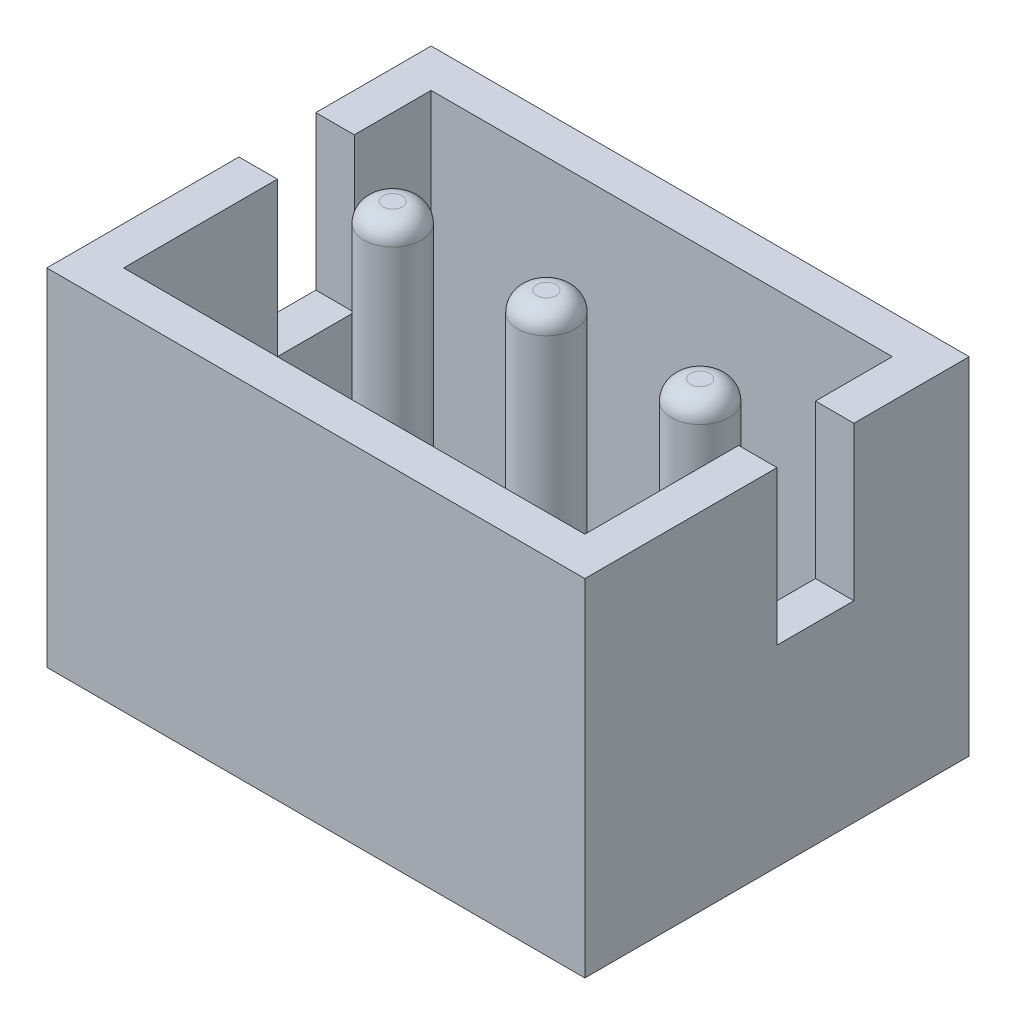
ISO-10303-21;
HEADER;
FILE_DESCRIPTION(('STEP AP214'),'2;1');
FILE_NAME('part.step','',(''),(''),'','','');
FILE_SCHEMA(('AUTOMOTIVE_DESIGN { 1 0 10303 214 1 1 1 1 }'));
ENDSEC;
DATA;
#1=APPLICATION_CONTEXT('core data for automotive mechanical design processes');
#2=APPLICATION_PROTOCOL_DEFINITION('international standard','automotive_design',2000,#1);
#3=PRODUCT_CONTEXT('',#1,'mechanical');
#4=PRODUCT('Part','Part','',(#3));
#5=PRODUCT_RELATED_PRODUCT_CATEGORY('part','',(#4));
#6=PRODUCT_DEFINITION_FORMATION('','',#4);
#7=PRODUCT_DEFINITION_CONTEXT('part definition',#1,'design');
#8=PRODUCT_DEFINITION('design','',#6,#7);
#9=PRODUCT_DEFINITION_SHAPE('','',#8);
#10=(LENGTH_UNIT() NAMED_UNIT(*) SI_UNIT(.MILLI.,.METRE.));
#11=(NAMED_UNIT(*) PLANE_ANGLE_UNIT() SI_UNIT($,.RADIAN.));
#12=(NAMED_UNIT(*) SI_UNIT($,.STERADIAN.) SOLID_ANGLE_UNIT());
#13=UNCERTAINTY_MEASURE_WITH_UNIT(LENGTH_MEASURE(1.E-05),#10,'distance_accuracy_value','');
#14=(GEOMETRIC_REPRESENTATION_CONTEXT(3) GLOBAL_UNCERTAINTY_ASSIGNED_CONTEXT((#13)) GLOBAL_UNIT_ASSIGNED_CONTEXT((#10,
#11,#12)) REPRESENTATION_CONTEXT('',''));
#15=CARTESIAN_POINT('',(0.,0.,0.));
#16=DIRECTION('',(0.,0.,1.));
#17=DIRECTION('',(1.,0.,0.));
#18=AXIS2_PLACEMENT_3D('',#15,#16,#17);
#19=CARTESIAN_POINT('',(3.,4.5,2.));
#20=DIRECTION('',(-1.,0.,0.));
#21=DIRECTION('',(0.,0.,1.));
#22=AXIS2_PLACEMENT_3D('',#19,#20,#21);
#23=PLANE('',#22);
#24=DIRECTION('',(0.,1.,0.));
#25=VECTOR('',#24,1.);
#26=CARTESIAN_POINT('',(3.,2.5,-1.));
#27=LINE('',#26,#25);
#28=CARTESIAN_POINT('',(3.,2.5,-1.));
#29=VERTEX_POINT('',#28);
#30=CARTESIAN_POINT('',(3.,4.5,-1.));
#31=VERTEX_POINT('',#30);
#32=EDGE_CURVE('E325',#29,#31,#27,.T.);
#33=ORIENTED_EDGE('',*,*,#32,.T.);
#34=DIRECTION('',(0.,0.,-1.));
#35=VECTOR('',#34,1.);
#36=CARTESIAN_POINT('',(3.,4.5,2.));
#37=LINE('',#36,#35);
#38=CARTESIAN_POINT('',(3.,4.5,-2.));
#39=VERTEX_POINT('',#38);
#40=EDGE_CURVE('E202',#31,#39,#37,.T.);
#41=ORIENTED_EDGE('',*,*,#40,.T.);
#42=DIRECTION('',(0.,-1.,0.));
#43=VECTOR('',#42,1.);
#44=CARTESIAN_POINT('',(3.,4.5,-2.));
#45=LINE('',#44,#43);
#46=CARTESIAN_POINT('',(3.,0.5,-2.));
#47=VERTEX_POINT('',#46);
#48=EDGE_CURVE('E209',#39,#47,#45,.T.);
#49=ORIENTED_EDGE('',*,*,#48,.T.);
#50=DIRECTION('',(0.,0.,-1.));
#51=VECTOR('',#50,1.);
#52=CARTESIAN_POINT('',(3.,0.5,2.));
#53=LINE('',#52,#51);
#54=CARTESIAN_POINT('',(3.,0.5,2.));
#55=VERTEX_POINT('',#54);
#56=EDGE_CURVE('E193',#55,#47,#53,.T.);
#57=ORIENTED_EDGE('',*,*,#56,.F.);
#58=DIRECTION('',(0.,-1.,0.));
#59=VECTOR('',#58,1.);
#60=CARTESIAN_POINT('',(3.,4.5,2.));
#61=LINE('',#60,#59);
#62=CARTESIAN_POINT('',(3.,4.5,2.));
#63=VERTEX_POINT('',#62);
#64=EDGE_CURVE('E186',#63,#55,#61,.T.);
#65=ORIENTED_EDGE('',*,*,#64,.F.);
#66=CARTESIAN_POINT('',(3.,4.5,0.));
#67=VERTEX_POINT('',#66);
#68=EDGE_CURVE('E362',#63,#67,#37,.T.);
#69=ORIENTED_EDGE('',*,*,#68,.T.);
#70=DIRECTION('',(0.,-1.,0.));
#71=VECTOR('',#70,1.);
#72=CARTESIAN_POINT('',(3.,4.5,0.));
#73=LINE('',#72,#71);
#74=CARTESIAN_POINT('',(3.,2.5,0.));
#75=VERTEX_POINT('',#74);
#76=EDGE_CURVE('E164',#67,#75,#73,.T.);
#77=ORIENTED_EDGE('',*,*,#76,.T.);
#78=DIRECTION('',(0.,0.,-1.));
#79=VECTOR('',#78,1.);
#80=CARTESIAN_POINT('',(3.,2.5,0.));
#81=LINE('',#80,#79);
#82=EDGE_CURVE('E322',#75,#29,#81,.T.);
#83=ORIENTED_EDGE('',*,*,#82,.T.);
#84=EDGE_LOOP('',(#33,#41,#49,#57,#65,#69,#77,#83));
#85=FACE_BOUND('',#84,.T.);
#86=ADVANCED_FACE('F39',(#85),#23,.T.);
#87=CARTESIAN_POINT('',(-3.,4.5,-2.));
#88=DIRECTION('',(0.,0.,1.));
#89=DIRECTION('',(1.,0.,0.));
#90=AXIS2_PLACEMENT_3D('',#87,#88,#89);
#91=PLANE('',#90);
#92=DIRECTION('',(-1.,0.,0.));
#93=VECTOR('',#92,1.);
#94=CARTESIAN_POINT('',(-3.,0.5,-2.));
#95=LINE('',#94,#93);
#96=CARTESIAN_POINT('',(-3.,0.5,-2.));
#97=VERTEX_POINT('',#96);
#98=EDGE_CURVE('E196',#47,#97,#95,.T.);
#99=ORIENTED_EDGE('',*,*,#98,.F.);
#100=ORIENTED_EDGE('',*,*,#48,.F.);
#101=DIRECTION('',(-1.,0.,0.));
#102=VECTOR('',#101,1.);
#103=CARTESIAN_POINT('',(-3.,4.5,-2.));
#104=LINE('',#103,#102);
#105=CARTESIAN_POINT('',(-3.,4.5,-2.));
#106=VERTEX_POINT('',#105);
#107=EDGE_CURVE('E189',#39,#106,#104,.T.);
#108=ORIENTED_EDGE('',*,*,#107,.T.);
#109=DIRECTION('',(0.,-1.,0.));
#110=VECTOR('',#109,1.);
#111=CARTESIAN_POINT('',(-3.,4.5,-2.));
#112=LINE('',#111,#110);
#113=EDGE_CURVE('E181',#106,#97,#112,.T.);
#114=ORIENTED_EDGE('',*,*,#113,.T.);
#115=EDGE_LOOP('',(#99,#100,#108,#114));
#116=FACE_BOUND('',#115,.T.);
#117=ADVANCED_FACE('F255',(#116),#91,.T.);
#118=CARTESIAN_POINT('',(-3.,4.5,2.));
#119=DIRECTION('',(1.,0.,0.));
#120=DIRECTION('',(0.,0.,-1.));
#121=AXIS2_PLACEMENT_3D('',#118,#119,#120);
#122=PLANE('',#121);
#123=DIRECTION('',(0.,-1.,0.));
#124=VECTOR('',#123,1.);
#125=CARTESIAN_POINT('',(-3.,2.5,-1.));
#126=LINE('',#125,#124);
#127=CARTESIAN_POINT('',(-3.,4.5,-1.));
#128=VERTEX_POINT('',#127);
#129=CARTESIAN_POINT('',(-3.,2.5,-1.));
#130=VERTEX_POINT('',#129);
#131=EDGE_CURVE('E154',#128,#130,#126,.T.);
#132=ORIENTED_EDGE('',*,*,#131,.T.);
#133=DIRECTION('',(0.,0.,1.));
#134=VECTOR('',#133,1.);
#135=CARTESIAN_POINT('',(-3.,2.5,0.));
#136=LINE('',#135,#134);
#137=CARTESIAN_POINT('',(-3.,2.5,0.));
#138=VERTEX_POINT('',#137);
#139=EDGE_CURVE('E165',#130,#138,#136,.T.);
#140=ORIENTED_EDGE('',*,*,#139,.T.);
#141=DIRECTION('',(0.,1.,0.));
#142=VECTOR('',#141,1.);
#143=CARTESIAN_POINT('',(-3.,4.5,0.));
#144=LINE('',#143,#142);
#145=CARTESIAN_POINT('',(-3.,4.5,0.));
#146=VERTEX_POINT('',#145);
#147=EDGE_CURVE('E316',#138,#146,#144,.T.);
#148=ORIENTED_EDGE('',*,*,#147,.T.);
#149=DIRECTION('',(0.,0.,1.));
#150=VECTOR('',#149,1.);
#151=CARTESIAN_POINT('',(-3.,4.5,2.));
#152=LINE('',#151,#150);
#153=CARTESIAN_POINT('',(-3.,4.5,2.));
#154=VERTEX_POINT('',#153);
#155=EDGE_CURVE('E183',#146,#154,#152,.T.);
#156=ORIENTED_EDGE('',*,*,#155,.T.);
#157=DIRECTION('',(0.,-1.,0.));
#158=VECTOR('',#157,1.);
#159=CARTESIAN_POINT('',(-3.,4.5,2.));
#160=LINE('',#159,#158);
#161=CARTESIAN_POINT('',(-3.,0.5,2.));
#162=VERTEX_POINT('',#161);
#163=EDGE_CURVE('E205',#154,#162,#160,.T.);
#164=ORIENTED_EDGE('',*,*,#163,.T.);
#165=DIRECTION('',(0.,0.,1.));
#166=VECTOR('',#165,1.);
#167=CARTESIAN_POINT('',(-3.,0.5,2.));
#168=LINE('',#167,#166);
#169=EDGE_CURVE('E198',#97,#162,#168,.T.);
#170=ORIENTED_EDGE('',*,*,#169,.F.);
#171=ORIENTED_EDGE('',*,*,#113,.F.);
#172=EDGE_CURVE('E169',#106,#128,#152,.T.);
#173=ORIENTED_EDGE('',*,*,#172,.T.);
#174=EDGE_LOOP('',(#132,#140,#148,#156,#164,#170,#171,#173));
#175=FACE_BOUND('',#174,.T.);
#176=ADVANCED_FACE('F178',(#175),#122,.T.);
#177=CARTESIAN_POINT('',(-3.,4.5,2.));
#178=DIRECTION('',(0.,0.,-1.));
#179=DIRECTION('',(-1.,0.,0.));
#180=AXIS2_PLACEMENT_3D('',#177,#178,#179);
#181=PLANE('',#180);
#182=DIRECTION('',(1.,0.,0.));
#183=VECTOR('',#182,1.);
#184=CARTESIAN_POINT('',(-3.,0.5,2.));
#185=LINE('',#184,#183);
#186=EDGE_CURVE('E200',#162,#55,#185,.T.);
#187=ORIENTED_EDGE('',*,*,#186,.F.);
#188=ORIENTED_EDGE('',*,*,#163,.F.);
#189=DIRECTION('',(1.,0.,0.));
#190=VECTOR('',#189,1.);
#191=CARTESIAN_POINT('',(-3.,4.5,2.));
#192=LINE('',#191,#190);
#193=EDGE_CURVE('E182',#154,#63,#192,.T.);
#194=ORIENTED_EDGE('',*,*,#193,.T.);
#195=ORIENTED_EDGE('',*,*,#64,.T.);
#196=EDGE_LOOP('',(#187,#188,#194,#195));
#197=FACE_BOUND('',#196,.T.);
#198=ADVANCED_FACE('F373',(#197),#181,.T.);
#199=CARTESIAN_POINT('',(0.,0.5,0.));
#200=DIRECTION('',(0.,1.,0.));
#201=DIRECTION('',(0.,0.,1.));
#202=AXIS2_PLACEMENT_3D('',#199,#200,#201);
#203=PLANE('',#202);
#204=CARTESIAN_POINT('',(0.,0.5,-0.5));
#205=DIRECTION('',(0.,1.,0.));
#206=DIRECTION('',(0.,0.,1.));
#207=AXIS2_PLACEMENT_3D('',#204,#205,#206);
#208=CIRCLE('',#207,0.375);
#209=CARTESIAN_POINT('',(0.,0.5,-0.125));
#210=VERTEX_POINT('',#209);
#211=EDGE_CURVE('E306',#210,#210,#208,.T.);
#212=ORIENTED_EDGE('',*,*,#211,.F.);
#213=EDGE_LOOP('',(#212));
#214=FACE_BOUND('',#213,.T.);
#215=CARTESIAN_POINT('',(2.,0.5,-0.5));
#216=DIRECTION('',(0.,1.,0.));
#217=DIRECTION('',(0.,0.,1.));
#218=AXIS2_PLACEMENT_3D('',#215,#216,#217);
#219=CIRCLE('',#218,0.375);
#220=CARTESIAN_POINT('',(2.,0.5,-0.125000000000001));
#221=VERTEX_POINT('',#220);
#222=EDGE_CURVE('E308',#221,#221,#219,.T.);
#223=ORIENTED_EDGE('',*,*,#222,.F.);
#224=EDGE_LOOP('',(#223));
#225=FACE_BOUND('',#224,.T.);
#226=CARTESIAN_POINT('',(-2.,0.5,-0.5));
#227=DIRECTION('',(0.,1.,0.));
#228=DIRECTION('',(0.,0.,1.));
#229=AXIS2_PLACEMENT_3D('',#226,#227,#228);
#230=CIRCLE('',#229,0.375);
#231=CARTESIAN_POINT('',(-2.,0.5,-0.125));
#232=VERTEX_POINT('',#231);
#233=EDGE_CURVE('E311',#232,#232,#230,.T.);
#234=ORIENTED_EDGE('',*,*,#233,.F.);
#235=EDGE_LOOP('',(#234));
#236=FACE_BOUND('',#235,.T.);
#237=ORIENTED_EDGE('',*,*,#56,.T.);
#238=ORIENTED_EDGE('',*,*,#98,.T.);
#239=ORIENTED_EDGE('',*,*,#169,.T.);
#240=ORIENTED_EDGE('',*,*,#186,.T.);
#241=EDGE_LOOP('',(#237,#238,#239,#240));
#242=FACE_BOUND('',#241,.T.);
#243=ADVANCED_FACE('F370',(#214,#225,#236,#242),#203,.T.);
#244=CARTESIAN_POINT('',(-3.501,4.5,2.5));
#245=DIRECTION('',(0.,-1.,0.));
#246=DIRECTION('',(0.,0.,-1.));
#247=AXIS2_PLACEMENT_3D('',#244,#245,#246);
#248=PLANE('',#247);
#249=ORIENTED_EDGE('',*,*,#40,.F.);
#250=DIRECTION('',(1.,0.,0.));
#251=VECTOR('',#250,1.);
#252=CARTESIAN_POINT('',(-3.501,4.5,-1.));
#253=LINE('',#252,#251);
#254=CARTESIAN_POINT('',(3.5,4.5,-1.));
#255=VERTEX_POINT('',#254);
#256=EDGE_CURVE('E175',#31,#255,#253,.T.);
#257=ORIENTED_EDGE('',*,*,#256,.T.);
#258=DIRECTION('',(0.,0.,-1.));
#259=VECTOR('',#258,1.);
#260=CARTESIAN_POINT('',(3.5,4.5,-1.));
#261=LINE('',#260,#259);
#262=CARTESIAN_POINT('',(3.5,4.5,-2.5));
#263=VERTEX_POINT('',#262);
#264=EDGE_CURVE('E348',#255,#263,#261,.T.);
#265=ORIENTED_EDGE('',*,*,#264,.T.);
#266=DIRECTION('',(1.,0.,0.));
#267=VECTOR('',#266,1.);
#268=CARTESIAN_POINT('',(-3.501,4.5,-2.5));
#269=LINE('',#268,#267);
#270=CARTESIAN_POINT('',(-3.5,4.5,-2.5));
#271=VERTEX_POINT('',#270);
#272=EDGE_CURVE('E174',#271,#263,#269,.T.);
#273=ORIENTED_EDGE('',*,*,#272,.F.);
#274=DIRECTION('',(0.,0.,1.));
#275=VECTOR('',#274,1.);
#276=CARTESIAN_POINT('',(-3.5,4.5,-1.));
#277=LINE('',#276,#275);
#278=CARTESIAN_POINT('',(-3.5,4.5,-1.));
#279=VERTEX_POINT('',#278);
#280=EDGE_CURVE('E172',#271,#279,#277,.T.);
#281=ORIENTED_EDGE('',*,*,#280,.T.);
#282=EDGE_CURVE('E158',#279,#128,#253,.T.);
#283=ORIENTED_EDGE('',*,*,#282,.T.);
#284=ORIENTED_EDGE('',*,*,#172,.F.);
#285=ORIENTED_EDGE('',*,*,#107,.F.);
#286=EDGE_LOOP('',(#249,#257,#265,#273,#281,#283,#284,#285));
#287=FACE_BOUND('',#286,.T.);
#288=ADVANCED_FACE('F168',(#287),#248,.F.);
#289=CARTESIAN_POINT('',(-3.501,2.5,-1.));
#290=DIRECTION('',(0.,0.,-1.));
#291=DIRECTION('',(-1.,0.,0.));
#292=AXIS2_PLACEMENT_3D('',#289,#290,#291);
#293=PLANE('',#292);
#294=DIRECTION('',(0.,-1.,0.));
#295=VECTOR('',#294,1.);
#296=CARTESIAN_POINT('',(-3.5,2.5,-1.));
#297=LINE('',#296,#295);
#298=CARTESIAN_POINT('',(-3.5,2.5,-1.));
#299=VERTEX_POINT('',#298);
#300=EDGE_CURVE('E333',#279,#299,#297,.T.);
#301=ORIENTED_EDGE('',*,*,#300,.T.);
#302=DIRECTION('',(1.,0.,0.));
#303=VECTOR('',#302,1.);
#304=CARTESIAN_POINT('',(-3.501,2.5,-1.));
#305=LINE('',#304,#303);
#306=EDGE_CURVE('E160',#299,#130,#305,.T.);
#307=ORIENTED_EDGE('',*,*,#306,.T.);
#308=ORIENTED_EDGE('',*,*,#131,.F.);
#309=ORIENTED_EDGE('',*,*,#282,.F.);
#310=EDGE_LOOP('',(#301,#307,#308,#309));
#311=FACE_BOUND('',#310,.T.);
#312=ADVANCED_FACE('F157',(#311),#293,.F.);
#313=CARTESIAN_POINT('',(3.5,2.5,-1.));
#314=VERTEX_POINT('',#313);
#315=EDGE_CURVE('E353',#29,#314,#305,.T.);
#316=ORIENTED_EDGE('',*,*,#315,.T.);
#317=DIRECTION('',(0.,1.,0.));
#318=VECTOR('',#317,1.);
#319=CARTESIAN_POINT('',(3.5,2.5,-1.));
#320=LINE('',#319,#318);
#321=EDGE_CURVE('E345',#314,#255,#320,.T.);
#322=ORIENTED_EDGE('',*,*,#321,.T.);
#323=ORIENTED_EDGE('',*,*,#256,.F.);
#324=ORIENTED_EDGE('',*,*,#32,.F.);
#325=EDGE_LOOP('',(#316,#322,#323,#324));
#326=FACE_BOUND('',#325,.T.);
#327=ADVANCED_FACE('F399',(#326),#293,.F.);
#328=CARTESIAN_POINT('',(-3.501,2.5,0.));
#329=DIRECTION('',(0.,-1.,0.));
#330=DIRECTION('',(0.,0.,-1.));
#331=AXIS2_PLACEMENT_3D('',#328,#329,#330);
#332=PLANE('',#331);
#333=DIRECTION('',(0.,0.,1.));
#334=VECTOR('',#333,1.);
#335=CARTESIAN_POINT('',(-3.5,2.5,0.));
#336=LINE('',#335,#334);
#337=CARTESIAN_POINT('',(-3.5,2.5,0.));
#338=VERTEX_POINT('',#337);
#339=EDGE_CURVE('E330',#299,#338,#336,.T.);
#340=ORIENTED_EDGE('',*,*,#339,.T.);
#341=DIRECTION('',(1.,0.,0.));
#342=VECTOR('',#341,1.);
#343=CARTESIAN_POINT('',(-3.501,2.5,0.));
#344=LINE('',#343,#342);
#345=EDGE_CURVE('E355',#338,#138,#344,.T.);
#346=ORIENTED_EDGE('',*,*,#345,.T.);
#347=ORIENTED_EDGE('',*,*,#139,.F.);
#348=ORIENTED_EDGE('',*,*,#306,.F.);
#349=EDGE_LOOP('',(#340,#346,#347,#348));
#350=FACE_BOUND('',#349,.T.);
#351=ADVANCED_FACE('F381',(#350),#332,.F.);
#352=CARTESIAN_POINT('',(3.5,2.5,0.));
#353=VERTEX_POINT('',#352);
#354=EDGE_CURVE('E356',#75,#353,#344,.T.);
#355=ORIENTED_EDGE('',*,*,#354,.T.);
#356=DIRECTION('',(0.,0.,-1.));
#357=VECTOR('',#356,1.);
#358=CARTESIAN_POINT('',(3.5,2.5,0.));
#359=LINE('',#358,#357);
#360=EDGE_CURVE('E342',#353,#314,#359,.T.);
#361=ORIENTED_EDGE('',*,*,#360,.T.);
#362=ORIENTED_EDGE('',*,*,#315,.F.);
#363=ORIENTED_EDGE('',*,*,#82,.F.);
#364=EDGE_LOOP('',(#355,#361,#362,#363));
#365=FACE_BOUND('',#364,.T.);
#366=ADVANCED_FACE('F397',(#365),#332,.F.);
#367=CARTESIAN_POINT('',(-3.501,4.5,0.));
#368=DIRECTION('',(0.,0.,1.));
#369=DIRECTION('',(0.,-1.,0.));
#370=AXIS2_PLACEMENT_3D('',#367,#368,#369);
#371=PLANE('',#370);
#372=DIRECTION('',(0.,1.,0.));
#373=VECTOR('',#372,1.);
#374=CARTESIAN_POINT('',(-3.5,4.5,0.));
#375=LINE('',#374,#373);
#376=CARTESIAN_POINT('',(-3.5,4.5,0.));
#377=VERTEX_POINT('',#376);
#378=EDGE_CURVE('E327',#338,#377,#375,.T.);
#379=ORIENTED_EDGE('',*,*,#378,.T.);
#380=DIRECTION('',(1.,0.,0.));
#381=VECTOR('',#380,1.);
#382=CARTESIAN_POINT('',(-3.501,4.5,0.));
#383=LINE('',#382,#381);
#384=EDGE_CURVE('E358',#377,#146,#383,.T.);
#385=ORIENTED_EDGE('',*,*,#384,.T.);
#386=ORIENTED_EDGE('',*,*,#147,.F.);
#387=ORIENTED_EDGE('',*,*,#345,.F.);
#388=EDGE_LOOP('',(#379,#385,#386,#387));
#389=FACE_BOUND('',#388,.T.);
#390=ADVANCED_FACE('F379',(#389),#371,.F.);
#391=CARTESIAN_POINT('',(3.5,4.5,0.));
#392=VERTEX_POINT('',#391);
#393=EDGE_CURVE('E359',#67,#392,#383,.T.);
#394=ORIENTED_EDGE('',*,*,#393,.T.);
#395=DIRECTION('',(0.,-1.,0.));
#396=VECTOR('',#395,1.);
#397=CARTESIAN_POINT('',(3.5,4.5,0.));
#398=LINE('',#397,#396);
#399=EDGE_CURVE('E339',#392,#353,#398,.T.);
#400=ORIENTED_EDGE('',*,*,#399,.T.);
#401=ORIENTED_EDGE('',*,*,#354,.F.);
#402=ORIENTED_EDGE('',*,*,#76,.F.);
#403=EDGE_LOOP('',(#394,#400,#401,#402));
#404=FACE_BOUND('',#403,.T.);
#405=ADVANCED_FACE('F394',(#404),#371,.F.);
#406=ORIENTED_EDGE('',*,*,#68,.F.);
#407=ORIENTED_EDGE('',*,*,#193,.F.);
#408=ORIENTED_EDGE('',*,*,#155,.F.);
#409=ORIENTED_EDGE('',*,*,#384,.F.);
#410=DIRECTION('',(0.,0.,1.));
#411=VECTOR('',#410,1.);
#412=CARTESIAN_POINT('',(-3.5,4.5,2.5));
#413=LINE('',#412,#411);
#414=CARTESIAN_POINT('',(-3.5,4.5,2.5));
#415=VERTEX_POINT('',#414);
#416=EDGE_CURVE('E54',#377,#415,#413,.T.);
#417=ORIENTED_EDGE('',*,*,#416,.T.);
#418=DIRECTION('',(1.,0.,0.));
#419=VECTOR('',#418,1.);
#420=CARTESIAN_POINT('',(-3.501,4.5,2.5));
#421=LINE('',#420,#419);
#422=CARTESIAN_POINT('',(3.5,4.5,2.5));
#423=VERTEX_POINT('',#422);
#424=EDGE_CURVE('E350',#415,#423,#421,.T.);
#425=ORIENTED_EDGE('',*,*,#424,.T.);
#426=DIRECTION('',(0.,0.,-1.));
#427=VECTOR('',#426,1.);
#428=CARTESIAN_POINT('',(3.5,4.5,2.5));
#429=LINE('',#428,#427);
#430=EDGE_CURVE('E336',#423,#392,#429,.T.);
#431=ORIENTED_EDGE('',*,*,#430,.T.);
#432=ORIENTED_EDGE('',*,*,#393,.F.);
#433=EDGE_LOOP('',(#406,#407,#408,#409,#417,#425,#431,#432));
#434=FACE_BOUND('',#433,.T.);
#435=ADVANCED_FACE('F286',(#434),#248,.F.);
#436=CARTESIAN_POINT('',(3.5,5.,0.));
#437=DIRECTION('',(-1.,0.,0.));
#438=DIRECTION('',(0.,0.,1.));
#439=AXIS2_PLACEMENT_3D('',#436,#437,#438);
#440=PLANE('',#439);
#441=DIRECTION('',(0.,-1.,0.));
#442=VECTOR('',#441,1.);
#443=CARTESIAN_POINT('',(3.5,5.,-2.5));
#444=LINE('',#443,#442);
#445=CARTESIAN_POINT('',(3.5,0.,-2.5));
#446=VERTEX_POINT('',#445);
#447=EDGE_CURVE('E227',#263,#446,#444,.T.);
#448=ORIENTED_EDGE('',*,*,#447,.F.);
#449=ORIENTED_EDGE('',*,*,#264,.F.);
#450=ORIENTED_EDGE('',*,*,#321,.F.);
#451=ORIENTED_EDGE('',*,*,#360,.F.);
#452=ORIENTED_EDGE('',*,*,#399,.F.);
#453=ORIENTED_EDGE('',*,*,#430,.F.);
#454=DIRECTION('',(0.,-1.,0.));
#455=VECTOR('',#454,1.);
#456=CARTESIAN_POINT('',(3.5,5.,2.5));
#457=LINE('',#456,#455);
#458=CARTESIAN_POINT('',(3.5,0.,2.5));
#459=VERTEX_POINT('',#458);
#460=EDGE_CURVE('E62',#423,#459,#457,.T.);
#461=ORIENTED_EDGE('',*,*,#460,.T.);
#462=DIRECTION('',(0.,0.,-1.));
#463=VECTOR('',#462,1.);
#464=CARTESIAN_POINT('',(3.5,0.,0.));
#465=LINE('',#464,#463);
#466=EDGE_CURVE('E212',#459,#446,#465,.T.);
#467=ORIENTED_EDGE('',*,*,#466,.T.);
#468=EDGE_LOOP('',(#448,#449,#450,#451,#452,#453,#461,#467));
#469=FACE_BOUND('',#468,.T.);
#470=ADVANCED_FACE('F282',(#469),#440,.F.);
#471=CARTESIAN_POINT('',(0.,5.,-2.5));
#472=DIRECTION('',(0.,0.,1.));
#473=DIRECTION('',(1.,0.,0.));
#474=AXIS2_PLACEMENT_3D('',#471,#472,#473);
#475=PLANE('',#474);
#476=DIRECTION('',(0.,-1.,0.));
#477=VECTOR('',#476,1.);
#478=CARTESIAN_POINT('',(-3.5,5.,-2.5));
#479=LINE('',#478,#477);
#480=CARTESIAN_POINT('',(-3.5,0.,-2.5));
#481=VERTEX_POINT('',#480);
#482=EDGE_CURVE('E225',#271,#481,#479,.T.);
#483=ORIENTED_EDGE('',*,*,#482,.F.);
#484=ORIENTED_EDGE('',*,*,#272,.T.);
#485=ORIENTED_EDGE('',*,*,#447,.T.);
#486=DIRECTION('',(-1.,0.,0.));
#487=VECTOR('',#486,1.);
#488=CARTESIAN_POINT('',(0.,0.,-2.5));
#489=LINE('',#488,#487);
#490=EDGE_CURVE('E214',#446,#481,#489,.T.);
#491=ORIENTED_EDGE('',*,*,#490,.T.);
#492=EDGE_LOOP('',(#483,#484,#485,#491));
#493=FACE_BOUND('',#492,.T.);
#494=ADVANCED_FACE('F278',(#493),#475,.F.);
#495=CARTESIAN_POINT('',(-3.5,5.,0.));
#496=DIRECTION('',(1.,0.,0.));
#497=DIRECTION('',(0.,0.,-1.));
#498=AXIS2_PLACEMENT_3D('',#495,#496,#497);
#499=PLANE('',#498);
#500=DIRECTION('',(0.,-1.,0.));
#501=VECTOR('',#500,1.);
#502=CARTESIAN_POINT('',(-3.5,5.,2.5));
#503=LINE('',#502,#501);
#504=CARTESIAN_POINT('',(-3.5,0.,2.5));
#505=VERTEX_POINT('',#504);
#506=EDGE_CURVE('E223',#415,#505,#503,.T.);
#507=ORIENTED_EDGE('',*,*,#506,.F.);
#508=ORIENTED_EDGE('',*,*,#416,.F.);
#509=ORIENTED_EDGE('',*,*,#378,.F.);
#510=ORIENTED_EDGE('',*,*,#339,.F.);
#511=ORIENTED_EDGE('',*,*,#300,.F.);
#512=ORIENTED_EDGE('',*,*,#280,.F.);
#513=ORIENTED_EDGE('',*,*,#482,.T.);
#514=DIRECTION('',(0.,0.,1.));
#515=VECTOR('',#514,1.);
#516=CARTESIAN_POINT('',(-3.5,0.,0.));
#517=LINE('',#516,#515);
#518=EDGE_CURVE('E217',#481,#505,#517,.T.);
#519=ORIENTED_EDGE('',*,*,#518,.T.);
#520=EDGE_LOOP('',(#507,#508,#509,#510,#511,#512,#513,#519));
#521=FACE_BOUND('',#520,.T.);
#522=ADVANCED_FACE('F274',(#521),#499,.F.);
#523=CARTESIAN_POINT('',(0.,5.,2.5));
#524=DIRECTION('',(0.,0.,-1.));
#525=DIRECTION('',(-1.,0.,0.));
#526=AXIS2_PLACEMENT_3D('',#523,#524,#525);
#527=PLANE('',#526);
#528=ORIENTED_EDGE('',*,*,#460,.F.);
#529=ORIENTED_EDGE('',*,*,#424,.F.);
#530=ORIENTED_EDGE('',*,*,#506,.T.);
#531=DIRECTION('',(1.,0.,0.));
#532=VECTOR('',#531,1.);
#533=CARTESIAN_POINT('',(0.,0.,2.5));
#534=LINE('',#533,#532);
#535=EDGE_CURVE('E220',#505,#459,#534,.T.);
#536=ORIENTED_EDGE('',*,*,#535,.T.);
#537=EDGE_LOOP('',(#528,#529,#530,#536));
#538=FACE_BOUND('',#537,.T.);
#539=ADVANCED_FACE('F270',(#538),#527,.F.);
#540=CARTESIAN_POINT('',(0.,0.,0.));
#541=DIRECTION('',(0.,1.,0.));
#542=DIRECTION('',(0.,0.,1.));
#543=AXIS2_PLACEMENT_3D('',#540,#541,#542);
#544=PLANE('',#543);
#545=ORIENTED_EDGE('',*,*,#466,.F.);
#546=ORIENTED_EDGE('',*,*,#535,.F.);
#547=ORIENTED_EDGE('',*,*,#518,.F.);
#548=ORIENTED_EDGE('',*,*,#490,.F.);
#549=EDGE_LOOP('',(#545,#546,#547,#548));
#550=FACE_BOUND('',#549,.T.);
#551=ADVANCED_FACE('F266',(#550),#544,.F.);
#552=CARTESIAN_POINT('',(-2.,4.5,-0.5));
#553=DIRECTION('',(0.,-1.,0.));
#554=DIRECTION('',(0.,0.,-1.));
#555=AXIS2_PLACEMENT_3D('',#552,#553,#554);
#556=CYLINDRICAL_SURFACE('',#555,0.375);
#557=CARTESIAN_POINT('',(-2.,4.25,-0.5));
#558=DIRECTION('',(0.,1.,0.));
#559=DIRECTION('',(0.,0.,1.));
#560=AXIS2_PLACEMENT_3D('',#557,#558,#559);
#561=CIRCLE('',#560,0.375);
#562=CARTESIAN_POINT('',(-2.,4.25,-0.125));
#563=VERTEX_POINT('',#562);
#564=EDGE_CURVE('E11',#563,#563,#561,.F.);
#565=ORIENTED_EDGE('',*,*,#564,.T.);
#566=EDGE_LOOP('',(#565));
#567=FACE_BOUND('',#566,.T.);
#568=ORIENTED_EDGE('',*,*,#233,.T.);
#569=EDGE_LOOP('',(#568));
#570=FACE_BOUND('',#569,.T.);
#571=ADVANCED_FACE('F269',(#567,#570),#556,.T.);
#572=CARTESIAN_POINT('',(-2.,4.5,-0.5));
#573=DIRECTION('',(0.,1.,0.));
#574=DIRECTION('',(0.,0.,1.));
#575=AXIS2_PLACEMENT_3D('',#572,#573,#574);
#576=PLANE('',#575);
#577=CARTESIAN_POINT('',(-2.,4.5,-0.5));
#578=DIRECTION('',(0.,1.,0.));
#579=DIRECTION('',(0.,0.,1.));
#580=AXIS2_PLACEMENT_3D('',#577,#578,#579);
#581=CIRCLE('',#580,0.125);
#582=CARTESIAN_POINT('',(-2.,4.5,-0.375));
#583=VERTEX_POINT('',#582);
#584=EDGE_CURVE('E47',#583,#583,#581,.T.);
#585=ORIENTED_EDGE('',*,*,#584,.T.);
#586=EDGE_LOOP('',(#585));
#587=FACE_BOUND('',#586,.T.);
#588=ADVANCED_FACE('F243',(#587),#576,.T.);
#589=CARTESIAN_POINT('',(2.,4.5,-0.5));
#590=DIRECTION('',(0.,-1.,0.));
#591=DIRECTION('',(0.,0.,-1.));
#592=AXIS2_PLACEMENT_3D('',#589,#590,#591);
#593=CYLINDRICAL_SURFACE('',#592,0.375);
#594=CARTESIAN_POINT('',(2.,4.25,-0.5));
#595=DIRECTION('',(0.,1.,0.));
#596=DIRECTION('',(0.,0.,1.));
#597=AXIS2_PLACEMENT_3D('',#594,#595,#596);
#598=CIRCLE('',#597,0.375);
#599=CARTESIAN_POINT('',(2.,4.25,-0.125000000000001));
#600=VERTEX_POINT('',#599);
#601=EDGE_CURVE('E238',#600,#600,#598,.F.);
#602=ORIENTED_EDGE('',*,*,#601,.T.);
#603=EDGE_LOOP('',(#602));
#604=FACE_BOUND('',#603,.T.);
#605=ORIENTED_EDGE('',*,*,#222,.T.);
#606=EDGE_LOOP('',(#605));
#607=FACE_BOUND('',#606,.T.);
#608=ADVANCED_FACE('F524',(#604,#607),#593,.T.);
#609=CARTESIAN_POINT('',(2.,4.5,-0.5));
#610=DIRECTION('',(0.,1.,0.));
#611=DIRECTION('',(0.,0.,1.));
#612=AXIS2_PLACEMENT_3D('',#609,#610,#611);
#613=PLANE('',#612);
#614=CARTESIAN_POINT('',(2.,4.5,-0.5));
#615=DIRECTION('',(0.,1.,0.));
#616=DIRECTION('',(0.,0.,1.));
#617=AXIS2_PLACEMENT_3D('',#614,#615,#616);
#618=CIRCLE('',#617,0.125);
#619=CARTESIAN_POINT('',(2.,4.5,-0.375000000000001));
#620=VERTEX_POINT('',#619);
#621=EDGE_CURVE('E235',#620,#620,#618,.T.);
#622=ORIENTED_EDGE('',*,*,#621,.T.);
#623=EDGE_LOOP('',(#622));
#624=FACE_BOUND('',#623,.T.);
#625=ADVANCED_FACE('F302',(#624),#613,.T.);
#626=CARTESIAN_POINT('',(0.,4.5,-0.5));
#627=DIRECTION('',(0.,-1.,0.));
#628=DIRECTION('',(0.,0.,-1.));
#629=AXIS2_PLACEMENT_3D('',#626,#627,#628);
#630=CYLINDRICAL_SURFACE('',#629,0.375);
#631=CARTESIAN_POINT('',(0.,4.25,-0.5));
#632=DIRECTION('',(0.,1.,0.));
#633=DIRECTION('',(0.,0.,1.));
#634=AXIS2_PLACEMENT_3D('',#631,#632,#633);
#635=CIRCLE('',#634,0.375);
#636=CARTESIAN_POINT('',(0.,4.25,-0.125));
#637=VERTEX_POINT('',#636);
#638=EDGE_CURVE('E232',#637,#637,#635,.F.);
#639=ORIENTED_EDGE('',*,*,#638,.T.);
#640=EDGE_LOOP('',(#639));
#641=FACE_BOUND('',#640,.T.);
#642=ORIENTED_EDGE('',*,*,#211,.T.);
#643=EDGE_LOOP('',(#642));
#644=FACE_BOUND('',#643,.T.);
#645=ADVANCED_FACE('F293',(#641,#644),#630,.T.);
#646=CARTESIAN_POINT('',(0.,4.5,-0.5));
#647=DIRECTION('',(0.,1.,0.));
#648=DIRECTION('',(0.,0.,1.));
#649=AXIS2_PLACEMENT_3D('',#646,#647,#648);
#650=PLANE('',#649);
#651=CARTESIAN_POINT('',(0.,4.5,-0.5));
#652=DIRECTION('',(0.,1.,0.));
#653=DIRECTION('',(0.,0.,1.));
#654=AXIS2_PLACEMENT_3D('',#651,#652,#653);
#655=CIRCLE('',#654,0.125);
#656=CARTESIAN_POINT('',(0.,4.5,-0.375));
#657=VERTEX_POINT('',#656);
#658=EDGE_CURVE('E229',#657,#657,#655,.T.);
#659=ORIENTED_EDGE('',*,*,#658,.T.);
#660=EDGE_LOOP('',(#659));
#661=FACE_BOUND('',#660,.T.);
#662=ADVANCED_FACE('F288',(#661),#650,.T.);
#663=CARTESIAN_POINT('',(0.,4.25,-0.5));
#664=DIRECTION('',(0.,1.,0.));
#665=DIRECTION('',(0.,0.,1.));
#666=AXIS2_PLACEMENT_3D('',#663,#664,#665);
#667=DEGENERATE_TOROIDAL_SURFACE('',#666,0.125,0.25,.T.);
#668=ORIENTED_EDGE('',*,*,#638,.F.);
#669=EDGE_LOOP('',(#668));
#670=FACE_BOUND('',#669,.T.);
#671=ORIENTED_EDGE('',*,*,#658,.F.);
#672=EDGE_LOOP('',(#671));
#673=FACE_BOUND('',#672,.T.);
#674=ADVANCED_FACE('F251',(#670,#673),#667,.T.);
#675=CARTESIAN_POINT('',(2.,4.25,-0.5));
#676=DIRECTION('',(0.,1.,0.));
#677=DIRECTION('',(0.,0.,1.));
#678=AXIS2_PLACEMENT_3D('',#675,#676,#677);
#679=DEGENERATE_TOROIDAL_SURFACE('',#678,0.125,0.25,.T.);
#680=ORIENTED_EDGE('',*,*,#601,.F.);
#681=EDGE_LOOP('',(#680));
#682=FACE_BOUND('',#681,.T.);
#683=ORIENTED_EDGE('',*,*,#621,.F.);
#684=EDGE_LOOP('',(#683));
#685=FACE_BOUND('',#684,.T.);
#686=ADVANCED_FACE('F246',(#682,#685),#679,.T.);
#687=CARTESIAN_POINT('',(-2.,4.25,-0.5));
#688=DIRECTION('',(0.,1.,0.));
#689=DIRECTION('',(0.,0.,1.));
#690=AXIS2_PLACEMENT_3D('',#687,#688,#689);
#691=DEGENERATE_TOROIDAL_SURFACE('',#690,0.125,0.25,.T.);
#692=ORIENTED_EDGE('',*,*,#564,.F.);
#693=EDGE_LOOP('',(#692));
#694=FACE_BOUND('',#693,.T.);
#695=ORIENTED_EDGE('',*,*,#584,.F.);
#696=EDGE_LOOP('',(#695));
#697=FACE_BOUND('',#696,.T.);
#698=ADVANCED_FACE('F41',(#694,#697),#691,.T.);
#699=CLOSED_SHELL('',(#86,#117,#176,#198,#243,#288,#312,#327,#351,#366,#390,#405,#435,#470,#494,
#522,#539,#551,#571,#588,#608,#625,#645,#662,#674,#686,#698));
#700=MANIFOLD_SOLID_BREP('B2',#699);
#701=ADVANCED_BREP_SHAPE_REPRESENTATION('',(#18,#700),#14);
#702=SHAPE_DEFINITION_REPRESENTATION(#9,#701);
ENDSEC;
END-ISO-10303-21;
